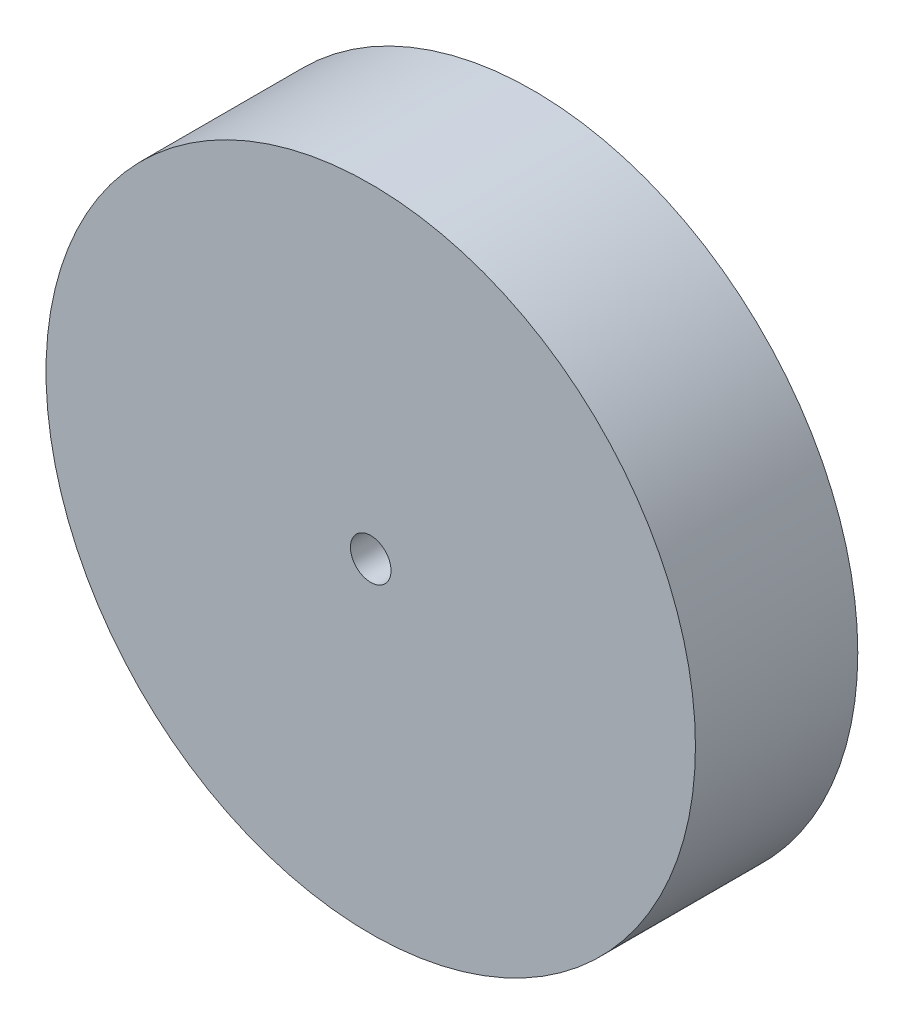
ISO-10303-21;
HEADER;
FILE_DESCRIPTION(('STEP AP214'),'2;1');
FILE_NAME('part.step','',(''),(''),'','','');
FILE_SCHEMA(('AUTOMOTIVE_DESIGN { 1 0 10303 214 1 1 1 1 }'));
ENDSEC;
DATA;
#1=APPLICATION_CONTEXT('core data for automotive mechanical design processes');
#2=APPLICATION_PROTOCOL_DEFINITION('international standard','automotive_design',2000,#1);
#3=PRODUCT_CONTEXT('',#1,'mechanical');
#4=PRODUCT('Part','Part','',(#3));
#5=PRODUCT_RELATED_PRODUCT_CATEGORY('part','',(#4));
#6=PRODUCT_DEFINITION_FORMATION('','',#4);
#7=PRODUCT_DEFINITION_CONTEXT('part definition',#1,'design');
#8=PRODUCT_DEFINITION('design','',#6,#7);
#9=PRODUCT_DEFINITION_SHAPE('','',#8);
#10=(LENGTH_UNIT() NAMED_UNIT(*) SI_UNIT(.MILLI.,.METRE.));
#11=(NAMED_UNIT(*) PLANE_ANGLE_UNIT() SI_UNIT($,.RADIAN.));
#12=(NAMED_UNIT(*) SI_UNIT($,.STERADIAN.) SOLID_ANGLE_UNIT());
#13=UNCERTAINTY_MEASURE_WITH_UNIT(LENGTH_MEASURE(1.E-05),#10,'distance_accuracy_value','');
#14=(GEOMETRIC_REPRESENTATION_CONTEXT(3) GLOBAL_UNCERTAINTY_ASSIGNED_CONTEXT((#13)) GLOBAL_UNIT_ASSIGNED_CONTEXT((#10,
#11,#12)) REPRESENTATION_CONTEXT('',''));
#15=CARTESIAN_POINT('',(0.,0.,0.));
#16=DIRECTION('',(0.,0.,1.));
#17=DIRECTION('',(1.,0.,0.));
#18=AXIS2_PLACEMENT_3D('',#15,#16,#17);
#19=CARTESIAN_POINT('',(0.,0.,50.8));
#20=DIRECTION('',(0.,0.,1.));
#21=DIRECTION('',(1.,0.,0.));
#22=AXIS2_PLACEMENT_3D('',#19,#20,#21);
#23=PLANE('',#22);
#24=CARTESIAN_POINT('',(0.,0.,50.8));
#25=DIRECTION('',(0.,0.,1.));
#26=DIRECTION('',(1.,0.,0.));
#27=AXIS2_PLACEMENT_3D('',#24,#25,#26);
#28=CIRCLE('',#27,101.6);
#29=CARTESIAN_POINT('',(101.6,0.,50.8));
#30=VERTEX_POINT('',#29);
#31=EDGE_CURVE('E10',#30,#30,#28,.T.);
#32=ORIENTED_EDGE('',*,*,#31,.T.);
#33=EDGE_LOOP('',(#32));
#34=FACE_BOUND('',#33,.T.);
#35=CARTESIAN_POINT('',(0.,0.,50.8));
#36=DIRECTION('',(0.,0.,1.));
#37=DIRECTION('',(1.,0.,0.));
#38=AXIS2_PLACEMENT_3D('',#35,#36,#37);
#39=CIRCLE('',#38,6.35);
#40=CARTESIAN_POINT('',(6.35,0.,50.8));
#41=VERTEX_POINT('',#40);
#42=EDGE_CURVE('E46',#41,#41,#39,.T.);
#43=ORIENTED_EDGE('',*,*,#42,.F.);
#44=EDGE_LOOP('',(#43));
#45=FACE_BOUND('',#44,.T.);
#46=ADVANCED_FACE('F35',(#34,#45),#23,.T.);
#47=CARTESIAN_POINT('',(0.,0.,0.));
#48=DIRECTION('',(0.,0.,1.));
#49=DIRECTION('',(1.,0.,0.));
#50=AXIS2_PLACEMENT_3D('',#47,#48,#49);
#51=PLANE('',#50);
#52=CARTESIAN_POINT('',(0.,0.,0.));
#53=DIRECTION('',(0.,0.,1.));
#54=DIRECTION('',(1.,0.,0.));
#55=AXIS2_PLACEMENT_3D('',#52,#53,#54);
#56=CIRCLE('',#55,101.6);
#57=CARTESIAN_POINT('',(101.6,0.,0.));
#58=VERTEX_POINT('',#57);
#59=EDGE_CURVE('E39',#58,#58,#56,.T.);
#60=ORIENTED_EDGE('',*,*,#59,.F.);
#61=EDGE_LOOP('',(#60));
#62=FACE_BOUND('',#61,.T.);
#63=CARTESIAN_POINT('',(0.,0.,0.));
#64=DIRECTION('',(0.,0.,1.));
#65=DIRECTION('',(1.,0.,0.));
#66=AXIS2_PLACEMENT_3D('',#63,#64,#65);
#67=CIRCLE('',#66,6.35);
#68=CARTESIAN_POINT('',(6.35,0.,0.));
#69=VERTEX_POINT('',#68);
#70=EDGE_CURVE('E48',#69,#69,#67,.T.);
#71=ORIENTED_EDGE('',*,*,#70,.T.);
#72=EDGE_LOOP('',(#71));
#73=FACE_BOUND('',#72,.T.);
#74=ADVANCED_FACE('F58',(#62,#73),#51,.F.);
#75=CARTESIAN_POINT('',(0.,0.,50.8));
#76=DIRECTION('',(0.,0.,-1.));
#77=DIRECTION('',(-1.,0.,0.));
#78=AXIS2_PLACEMENT_3D('',#75,#76,#77);
#79=CYLINDRICAL_SURFACE('',#78,101.6);
#80=ORIENTED_EDGE('',*,*,#31,.F.);
#81=EDGE_LOOP('',(#80));
#82=FACE_BOUND('',#81,.T.);
#83=ORIENTED_EDGE('',*,*,#59,.T.);
#84=EDGE_LOOP('',(#83));
#85=FACE_BOUND('',#84,.T.);
#86=ADVANCED_FACE('F37',(#82,#85),#79,.T.);
#87=CARTESIAN_POINT('',(0.,0.,50.8));
#88=DIRECTION('',(0.,0.,-1.));
#89=DIRECTION('',(-1.,0.,0.));
#90=AXIS2_PLACEMENT_3D('',#87,#88,#89);
#91=CYLINDRICAL_SURFACE('',#90,6.35);
#92=ORIENTED_EDGE('',*,*,#42,.T.);
#93=EDGE_LOOP('',(#92));
#94=FACE_BOUND('',#93,.T.);
#95=ORIENTED_EDGE('',*,*,#70,.F.);
#96=EDGE_LOOP('',(#95));
#97=FACE_BOUND('',#96,.T.);
#98=ADVANCED_FACE('F54',(#94,#97),#91,.F.);
#99=CLOSED_SHELL('',(#46,#74,#86,#98));
#100=MANIFOLD_SOLID_BREP('B2',#99);
#101=ADVANCED_BREP_SHAPE_REPRESENTATION('',(#18,#100),#14);
#102=SHAPE_DEFINITION_REPRESENTATION(#9,#101);
ENDSEC;
END-ISO-10303-21;
